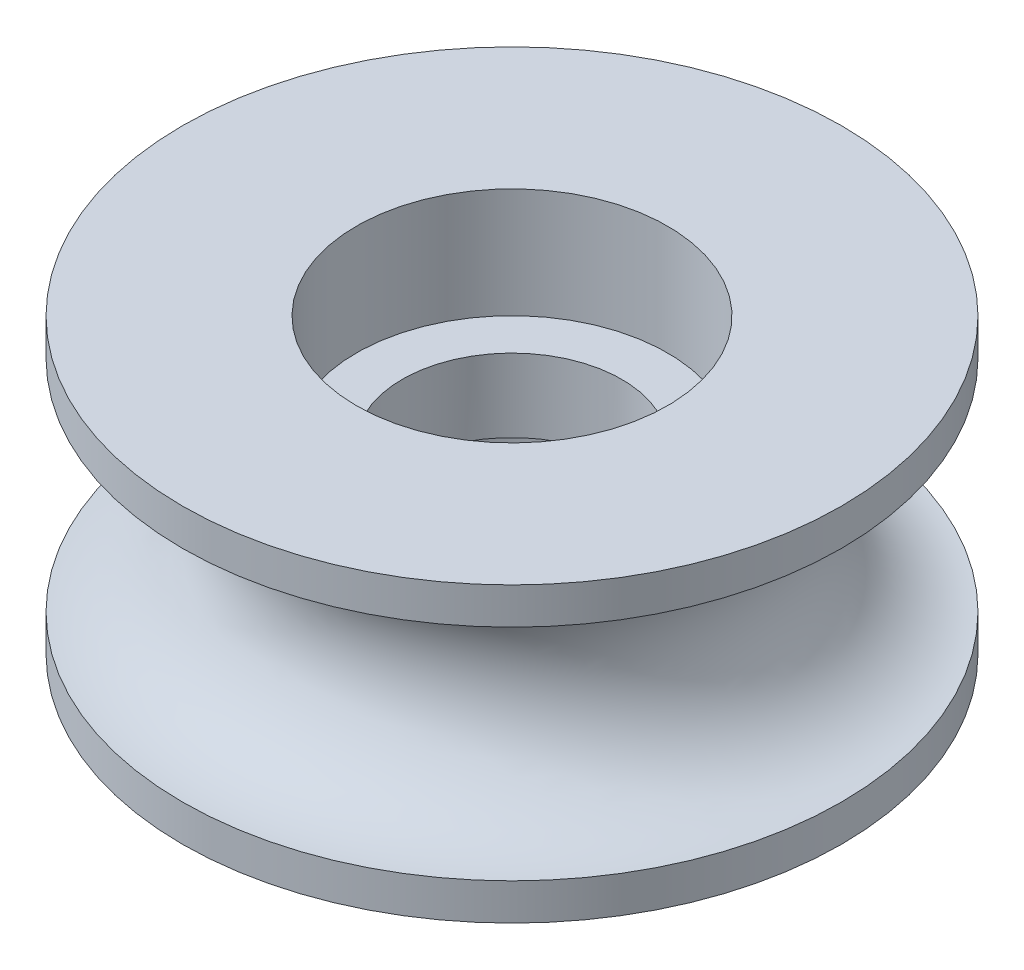
ISO-10303-21;
HEADER;
FILE_DESCRIPTION(('STEP AP214'),'2;1');
FILE_NAME('part.step','',(''),(''),'','','');
FILE_SCHEMA(('AUTOMOTIVE_DESIGN { 1 0 10303 214 1 1 1 1 }'));
ENDSEC;
DATA;
#1=APPLICATION_CONTEXT('core data for automotive mechanical design processes');
#2=APPLICATION_PROTOCOL_DEFINITION('international standard','automotive_design',2000,#1);
#3=PRODUCT_CONTEXT('',#1,'mechanical');
#4=PRODUCT('Part','Part','',(#3));
#5=PRODUCT_RELATED_PRODUCT_CATEGORY('part','',(#4));
#6=PRODUCT_DEFINITION_FORMATION('','',#4);
#7=PRODUCT_DEFINITION_CONTEXT('part definition',#1,'design');
#8=PRODUCT_DEFINITION('design','',#6,#7);
#9=PRODUCT_DEFINITION_SHAPE('','',#8);
#10=(LENGTH_UNIT() NAMED_UNIT(*) SI_UNIT(.MILLI.,.METRE.));
#11=(NAMED_UNIT(*) PLANE_ANGLE_UNIT() SI_UNIT($,.RADIAN.));
#12=(NAMED_UNIT(*) SI_UNIT($,.STERADIAN.) SOLID_ANGLE_UNIT());
#13=UNCERTAINTY_MEASURE_WITH_UNIT(LENGTH_MEASURE(1.E-05),#10,'distance_accuracy_value','');
#14=(GEOMETRIC_REPRESENTATION_CONTEXT(3) GLOBAL_UNCERTAINTY_ASSIGNED_CONTEXT((#13)) GLOBAL_UNIT_ASSIGNED_CONTEXT((#10,
#11,#12)) REPRESENTATION_CONTEXT('',''));
#15=CARTESIAN_POINT('',(0.,0.,0.));
#16=DIRECTION('',(0.,0.,1.));
#17=DIRECTION('',(1.,0.,0.));
#18=AXIS2_PLACEMENT_3D('',#15,#16,#17);
#19=CARTESIAN_POINT('',(0.,4.,0.));
#20=DIRECTION('',(0.,1.,0.));
#21=DIRECTION('',(0.,0.,1.));
#22=AXIS2_PLACEMENT_3D('',#19,#20,#21);
#23=TOROIDAL_SURFACE('',#22,9.,3.);
#24=CARTESIAN_POINT('',(0.,7.,0.));
#25=DIRECTION('',(0.,-1.,0.));
#26=DIRECTION('',(0.,0.,-1.));
#27=AXIS2_PLACEMENT_3D('',#24,#25,#26);
#28=CIRCLE('',#27,9.);
#29=CARTESIAN_POINT('',(0.,7.,-9.));
#30=VERTEX_POINT('',#29);
#31=EDGE_CURVE('E58',#30,#30,#28,.T.);
#32=ORIENTED_EDGE('',*,*,#31,.T.);
#33=EDGE_LOOP('',(#32));
#34=FACE_BOUND('',#33,.T.);
#35=CARTESIAN_POINT('',(0.,0.999999999999998,0.));
#36=DIRECTION('',(0.,1.,0.));
#37=DIRECTION('',(0.,0.,1.));
#38=AXIS2_PLACEMENT_3D('',#35,#36,#37);
#39=CIRCLE('',#38,9.);
#40=CARTESIAN_POINT('',(0.,0.999999999999997,9.));
#41=VERTEX_POINT('',#40);
#42=EDGE_CURVE('E64',#41,#41,#39,.T.);
#43=ORIENTED_EDGE('',*,*,#42,.T.);
#44=EDGE_LOOP('',(#43));
#45=FACE_BOUND('',#44,.T.);
#46=CARTESIAN_POINT('',(-0.839042216983241,2.7566142359992,-6.2134049162351));
#47=CARTESIAN_POINT('',(-0.778867445748128,2.71600835136603,-6.24019144374315));
#48=CARTESIAN_POINT('',(-0.715272521549356,2.67945023643533,-6.26571883641656));
#49=CARTESIAN_POINT('',(-0.581850639612137,2.61546722961522,-6.3119653978564));
#50=CARTESIAN_POINT('',(-0.512013539040098,2.5880575579636,-6.33267653664947));
#51=CARTESIAN_POINT('',(-0.366710249510084,2.5435204567773,-6.36702988057303));
#52=CARTESIAN_POINT('',(-0.291202168813316,2.52648021338659,-6.38061201763591));
#53=CARTESIAN_POINT('',(-0.137446277301218,2.5043009356807,-6.39839811977674));
#54=CARTESIAN_POINT('',(-0.0592037242286854,2.49914021389059,-6.40261917410458));
#55=CARTESIAN_POINT('',(0.0873574473999335,2.5009770383363,-6.4011329397644));
#56=CARTESIAN_POINT('',(0.15571220997481,2.5065562975115,-6.396583709015));
#57=CARTESIAN_POINT('',(0.290213304169746,2.52677040744972,-6.3803854676138));
#58=CARTESIAN_POINT('',(0.35635825660706,2.54141080612395,-6.36873210734518));
#59=CARTESIAN_POINT('',(0.484407612706894,2.57881266106255,-6.33975343529244));
#60=CARTESIAN_POINT('',(0.546338922656077,2.60151538456277,-6.32246921676347));
#61=CARTESIAN_POINT('',(0.665614995069776,2.65418730950447,-6.28378750894963));
#62=CARTESIAN_POINT('',(0.72295872497781,2.68415814074108,-6.2623890973244));
#63=CARTESIAN_POINT('',(0.843230237587762,2.7570907593742,-6.21263847660017));
#64=CARTESIAN_POINT('',(0.905088071315008,2.80144440374656,-6.18374218360401));
#65=CARTESIAN_POINT('',(1.02117444063432,2.89866152083008,-6.12473631233379));
#66=CARTESIAN_POINT('',(1.07539095557328,2.95153812712575,-6.09462491619294));
#67=CARTESIAN_POINT('',(1.18456041991482,3.0754424183087,-6.03022944707885));
#68=CARTESIAN_POINT('',(1.23789939232648,3.14802455546239,-5.99616632629478));
#69=CARTESIAN_POINT('',(1.33146740398419,3.30331331864723,-5.9335890951142));
#70=CARTESIAN_POINT('',(1.37171934334296,3.38600190729159,-5.90506532739615));
#71=CARTESIAN_POINT('',(1.42836087680804,3.53689779547174,-5.86384885278519));
#72=CARTESIAN_POINT('',(1.44824192527958,3.60319586842123,-5.8489655854473));
#73=CARTESIAN_POINT('',(1.47875066463392,3.73899381889097,-5.82588206309383));
#74=CARTESIAN_POINT('',(1.48938882404946,3.80848998002034,-5.81767424811004));
#75=CARTESIAN_POINT('',(1.50079618314392,3.94903595674643,-5.808866638289));
#76=CARTESIAN_POINT('',(1.50152990848995,4.02009044449096,-5.80829419084287));
#77=CARTESIAN_POINT('',(1.49298503692333,4.16123865781718,-5.81490086283688));
#78=CARTESIAN_POINT('',(1.4837030225688,4.23133204719872,-5.82208262807026));
#79=CARTESIAN_POINT('',(1.45639921181877,4.36516559179448,-5.84282412822178));
#80=CARTESIAN_POINT('',(1.43881971929192,4.42904915063551,-5.85606014014815));
#81=CARTESIAN_POINT('',(1.39594578860551,4.55283909027654,-5.88753138014321));
#82=CARTESIAN_POINT('',(1.37064933999496,4.61274442969736,-5.90576791084083));
#83=CARTESIAN_POINT('',(1.30941786113015,4.73533220969837,-5.94844452811385));
#84=CARTESIAN_POINT('',(1.27252631407175,4.79736007818853,-5.9733832430179));
#85=CARTESIAN_POINT('',(1.19088377873181,4.91483463353285,-6.02584859914111));
#86=CARTESIAN_POINT('',(1.14612416004607,4.97027398041858,-6.05337806656145));
#87=CARTESIAN_POINT('',(1.03963295063424,5.08464037760304,-6.11472205704535));
#88=CARTESIAN_POINT('',(0.976299580335855,5.14200662852129,-6.14868203816568));
#89=CARTESIAN_POINT('',(0.840006796243279,5.24567659019197,-6.21415756623795));
#90=CARTESIAN_POINT('',(0.767051064051845,5.29198451301062,-6.24567404081129));
#91=CARTESIAN_POINT('',(0.626624032484747,5.36469192103388,-6.29735574765852));
#92=CARTESIAN_POINT('',(0.560620727684522,5.39318770984243,-6.31854250083015));
#93=CARTESIAN_POINT('',(0.423703405723931,5.44073290161824,-6.35472652542713));
#94=CARTESIAN_POINT('',(0.352795664241826,5.45979413112745,-6.36973154189218));
#95=CARTESIAN_POINT('',(0.207124015948497,5.48749108365551,-6.39175805709268));
#96=CARTESIAN_POINT('',(0.132334569372909,5.49604520066782,-6.39871704023211));
#97=CARTESIAN_POINT('',(-0.0179590566370165,5.50177371454733,-6.40336098497587));
#98=CARTESIAN_POINT('',(-0.0934629065066517,5.49895312562019,-6.40105003296175));
#99=CARTESIAN_POINT('',(-0.233517896272023,5.48318682660209,-6.3883501445157));
#100=CARTESIAN_POINT('',(-0.298307756316123,5.47147888751189,-6.37894957100473));
#101=CARTESIAN_POINT('',(-0.424762785718026,5.44007894262858,-6.35431619134525));
#102=CARTESIAN_POINT('',(-0.486425790205714,5.42038148798274,-6.33907940529305));
#103=CARTESIAN_POINT('',(-0.624567273337318,5.3663923993026,-6.29863135298671));
#104=CARTESIAN_POINT('',(-0.699530667800213,5.32945248471617,-6.27178911613889));
#105=CARTESIAN_POINT('',(-0.84118749124277,5.24468574423585,-6.21374626541252));
#106=CARTESIAN_POINT('',(-0.907867013119732,5.19684098274864,-6.18253850443171));
#107=CARTESIAN_POINT('',(-1.03310359740046,5.09065421393269,-6.11843623248134));
#108=CARTESIAN_POINT('',(-1.09153880302711,5.03217916596821,-6.08552463364408));
#109=CARTESIAN_POINT('',(-1.1984004969118,4.90590700702718,-6.02145196772252));
#110=CARTESIAN_POINT('',(-1.24683506903542,4.8381174996717,-5.99028950170834));
#111=CARTESIAN_POINT('',(-1.32721061133285,4.70279032382235,-5.93633752668418));
#112=CARTESIAN_POINT('',(-1.36044856694665,4.636251006281,-5.91298944169951));
#113=CARTESIAN_POINT('',(-1.41710823493711,4.49740601018439,-5.87219502662799));
#114=CARTESIAN_POINT('',(-1.44053793652232,4.42510508205912,-5.8547438954833));
#115=CARTESIAN_POINT('',(-1.47645540236191,4.27571592934383,-5.8276578302596));
#116=CARTESIAN_POINT('',(-1.48885329366726,4.19859376526119,-5.81808714205552));
#117=CARTESIAN_POINT('',(-1.50142060757287,4.04278148925735,-5.80838509764423));
#118=CARTESIAN_POINT('',(-1.50159873480468,3.96409253339514,-5.80824702220623));
#119=CARTESIAN_POINT('',(-1.4905310950267,3.81851355083997,-5.81679201697756));
#120=CARTESIAN_POINT('',(-1.48078277813893,3.75143133734203,-5.82431881590392));
#121=CARTESIAN_POINT('',(-1.45266209218681,3.6201570193197,-5.84564135631663));
#122=CARTESIAN_POINT('',(-1.43428815138696,3.55596544385596,-5.85943824030456));
#123=CARTESIAN_POINT('',(-1.38885165385155,3.42919994802583,-5.89267074567006));
#124=CARTESIAN_POINT('',(-1.36146632182186,3.3667978042782,-5.91231274864048));
#125=CARTESIAN_POINT('',(-1.29918554779437,3.24722541288822,-5.95536568786954));
#126=CARTESIAN_POINT('',(-1.26428131654431,3.1900614008151,-5.97878102684748));
#127=CARTESIAN_POINT('',(-1.1802431564614,3.07083789567037,-6.03254993555786));
#128=CARTESIAN_POINT('',(-1.1296612523333,3.0100097393912,-6.06336453383014));
#129=CARTESIAN_POINT('',(-1.01981900416562,2.89720869675225,-6.12536638270032));
#130=CARTESIAN_POINT('',(-0.960576408408863,2.84521815986278,-6.15655275416433));
#131=CARTESIAN_POINT('',(-0.878272671222334,2.783775059369,-6.1956404859258));
#132=CARTESIAN_POINT('',(-0.858842598380422,2.7699755165858,-6.20459086592665));
#133=CARTESIAN_POINT('',(-0.839042216983241,2.7566142359992,-6.2134049162351));
#134=B_SPLINE_CURVE_WITH_KNOTS('',3,(#46,#47,#48,#49,#50,#51,#52,#53,#54,#55,#56,#57,#58,#59,
#60,#61,#62,#63,#64,#65,#66,#67,#68,#69,#70,#71,#72,#73,#74,#75,#76,#77,#78,#79,#80,#81,#82,#83,
#84,#85,#86,#87,#88,#89,#90,#91,#92,#93,#94,#95,#96,#97,#98,#99,#100,#101,#102,#103,#104,#105,
#106,#107,#108,#109,#110,#111,#112,#113,#114,#115,#116,#117,#118,#119,#120,#121,#122,#123,#124,
#125,#126,#127,#128,#129,#130,#131,#132,#133),.UNSPECIFIED.,.T.,.F.,(4,2,2,2,2,2,2,2,2,2,2,2,2,
2,2,2,2,2,2,2,2,2,2,2,2,2,2,2,2,2,2,2,2,2,2,2,2,2,2,2,2,2,2,4),(0.,0.232075184162651,
0.464534568616155,0.698922397816386,0.932881983721874,1.13804527395809,1.34333430503283,
1.54715752187379,1.75102648621461,1.99438561708667,2.23812340540085,2.52560298015834,
2.8125767721069,3.02409309032498,3.23536953085959,3.4474024921855,3.65950782355515,
3.86140108172995,4.06334698289434,4.2915962068457,4.52009737524529,4.79479404653178,
5.06938591963323,5.29336120682539,5.517055017773,5.74247543355111,5.96779649021174,
6.16645172457472,6.36524267030044,6.627174079626,6.88953944616072,7.15544809968685,
7.42114096102111,7.65409316140889,7.88685524211915,8.12149665162215,8.35597091483457,
8.55964709051773,8.76336039388072,8.97535307360315,9.18759492108332,9.44137355550077,
9.69463923024775,9.77100307949759),.UNSPECIFIED.);
#135=CARTESIAN_POINT('',(-0.839042216983241,2.7566142359992,-6.2134049162351));
#136=VERTEX_POINT('',#135);
#137=EDGE_CURVE('E10',#136,#136,#134,.T.);
#138=ORIENTED_EDGE('',*,*,#137,.T.);
#139=EDGE_LOOP('',(#138));
#140=FACE_BOUND('',#139,.T.);
#141=ADVANCED_FACE('F36',(#34,#45,#140),#23,.F.);
#142=CARTESIAN_POINT('',(0.,0.,0.));
#143=DIRECTION('',(0.,1.,0.));
#144=DIRECTION('',(0.,0.,1.));
#145=AXIS2_PLACEMENT_3D('',#142,#143,#144);
#146=CYLINDRICAL_SURFACE('',#145,3.);
#147=CARTESIAN_POINT('',(0.,5.,0.));
#148=DIRECTION('',(0.,1.,0.));
#149=DIRECTION('',(0.,0.,1.));
#150=AXIS2_PLACEMENT_3D('',#147,#148,#149);
#151=CIRCLE('',#150,3.);
#152=CARTESIAN_POINT('',(0.,5.,3.));
#153=VERTEX_POINT('',#152);
#154=EDGE_CURVE('E67',#153,#153,#151,.F.);
#155=ORIENTED_EDGE('',*,*,#154,.F.);
#156=EDGE_LOOP('',(#155));
#157=FACE_BOUND('',#156,.T.);
#158=CARTESIAN_POINT('',(0.,3.,0.));
#159=DIRECTION('',(0.,-1.,0.));
#160=DIRECTION('',(0.,0.,-1.));
#161=AXIS2_PLACEMENT_3D('',#158,#159,#160);
#162=CIRCLE('',#161,3.);
#163=CARTESIAN_POINT('',(0.,3.,-3.));
#164=VERTEX_POINT('',#163);
#165=EDGE_CURVE('E72',#164,#164,#162,.F.);
#166=ORIENTED_EDGE('',*,*,#165,.F.);
#167=EDGE_LOOP('',(#166));
#168=FACE_BOUND('',#167,.T.);
#169=ADVANCED_FACE('F109',(#157,#168),#146,.F.);
#170=CARTESIAN_POINT('',(0.,8.,0.));
#171=DIRECTION('',(0.,-1.,0.));
#172=DIRECTION('',(0.,0.,-1.));
#173=AXIS2_PLACEMENT_3D('',#170,#171,#172);
#174=CYLINDRICAL_SURFACE('',#173,9.);
#175=CARTESIAN_POINT('',(0.,8.,0.));
#176=DIRECTION('',(0.,1.,0.));
#177=DIRECTION('',(0.,0.,1.));
#178=AXIS2_PLACEMENT_3D('',#175,#176,#177);
#179=CIRCLE('',#178,9.);
#180=CARTESIAN_POINT('',(0.,8.,9.));
#181=VERTEX_POINT('',#180);
#182=EDGE_CURVE('E47',#181,#181,#179,.T.);
#183=ORIENTED_EDGE('',*,*,#182,.F.);
#184=EDGE_LOOP('',(#183));
#185=FACE_BOUND('',#184,.T.);
#186=ORIENTED_EDGE('',*,*,#31,.F.);
#187=EDGE_LOOP('',(#186));
#188=FACE_BOUND('',#187,.T.);
#189=ADVANCED_FACE('F101',(#185,#188),#174,.T.);
#190=CARTESIAN_POINT('',(0.,8.,0.));
#191=DIRECTION('',(0.,1.,0.));
#192=DIRECTION('',(0.,0.,1.));
#193=AXIS2_PLACEMENT_3D('',#190,#191,#192);
#194=PLANE('',#193);
#195=CARTESIAN_POINT('',(0.,8.,0.));
#196=DIRECTION('',(0.,1.,0.));
#197=DIRECTION('',(0.,0.,1.));
#198=AXIS2_PLACEMENT_3D('',#195,#196,#197);
#199=CIRCLE('',#198,4.25);
#200=CARTESIAN_POINT('',(0.,8.,4.25));
#201=VERTEX_POINT('',#200);
#202=EDGE_CURVE('E61',#201,#201,#199,.T.);
#203=ORIENTED_EDGE('',*,*,#202,.F.);
#204=EDGE_LOOP('',(#203));
#205=FACE_BOUND('',#204,.T.);
#206=ORIENTED_EDGE('',*,*,#182,.T.);
#207=EDGE_LOOP('',(#206));
#208=FACE_BOUND('',#207,.T.);
#209=ADVANCED_FACE('F98',(#205,#208),#194,.T.);
#210=ORIENTED_EDGE('',*,*,#137,.F.);
#211=EDGE_LOOP('',(#210));
#212=FACE_BOUND('',#211,.T.);
#213=ADVANCED_FACE('F100',(#212),#23,.F.);
#214=CARTESIAN_POINT('',(0.,0.,0.));
#215=DIRECTION('',(0.,1.,0.));
#216=DIRECTION('',(0.,0.,1.));
#217=AXIS2_PLACEMENT_3D('',#214,#215,#216);
#218=PLANE('',#217);
#219=CARTESIAN_POINT('',(0.,0.,0.));
#220=DIRECTION('',(0.,1.,0.));
#221=DIRECTION('',(0.,0.,1.));
#222=AXIS2_PLACEMENT_3D('',#219,#220,#221);
#223=CIRCLE('',#222,4.25);
#224=CARTESIAN_POINT('',(0.,0.,4.25));
#225=VERTEX_POINT('',#224);
#226=EDGE_CURVE('E79',#225,#225,#223,.T.);
#227=ORIENTED_EDGE('',*,*,#226,.T.);
#228=EDGE_LOOP('',(#227));
#229=FACE_BOUND('',#228,.T.);
#230=CARTESIAN_POINT('',(0.,0.,0.));
#231=DIRECTION('',(0.,1.,0.));
#232=DIRECTION('',(0.,0.,1.));
#233=AXIS2_PLACEMENT_3D('',#230,#231,#232);
#234=CIRCLE('',#233,9.);
#235=CARTESIAN_POINT('',(0.,0.,9.));
#236=VERTEX_POINT('',#235);
#237=EDGE_CURVE('E53',#236,#236,#234,.T.);
#238=ORIENTED_EDGE('',*,*,#237,.F.);
#239=EDGE_LOOP('',(#238));
#240=FACE_BOUND('',#239,.T.);
#241=ADVANCED_FACE('F107',(#229,#240),#218,.F.);
#242=ORIENTED_EDGE('',*,*,#237,.T.);
#243=EDGE_LOOP('',(#242));
#244=FACE_BOUND('',#243,.T.);
#245=ORIENTED_EDGE('',*,*,#42,.F.);
#246=EDGE_LOOP('',(#245));
#247=FACE_BOUND('',#246,.T.);
#248=ADVANCED_FACE('F112',(#244,#247),#174,.T.);
#249=CARTESIAN_POINT('',(0.,5.,0.));
#250=DIRECTION('',(0.,1.,0.));
#251=DIRECTION('',(0.,0.,1.));
#252=AXIS2_PLACEMENT_3D('',#249,#250,#251);
#253=PLANE('',#252);
#254=CARTESIAN_POINT('',(0.,5.,0.));
#255=DIRECTION('',(0.,1.,0.));
#256=DIRECTION('',(0.,0.,1.));
#257=AXIS2_PLACEMENT_3D('',#254,#255,#256);
#258=CIRCLE('',#257,4.25);
#259=CARTESIAN_POINT('',(0.,5.,4.25));
#260=VERTEX_POINT('',#259);
#261=EDGE_CURVE('E71',#260,#260,#258,.T.);
#262=ORIENTED_EDGE('',*,*,#261,.T.);
#263=EDGE_LOOP('',(#262));
#264=FACE_BOUND('',#263,.T.);
#265=ORIENTED_EDGE('',*,*,#154,.T.);
#266=EDGE_LOOP('',(#265));
#267=FACE_BOUND('',#266,.T.);
#268=ADVANCED_FACE('F88',(#264,#267),#253,.T.);
#269=CARTESIAN_POINT('',(0.,5.,0.));
#270=DIRECTION('',(0.,1.,0.));
#271=DIRECTION('',(0.,0.,1.));
#272=AXIS2_PLACEMENT_3D('',#269,#270,#271);
#273=CYLINDRICAL_SURFACE('',#272,4.25);
#274=ORIENTED_EDGE('',*,*,#261,.F.);
#275=EDGE_LOOP('',(#274));
#276=FACE_BOUND('',#275,.T.);
#277=ORIENTED_EDGE('',*,*,#202,.T.);
#278=EDGE_LOOP('',(#277));
#279=FACE_BOUND('',#278,.T.);
#280=ADVANCED_FACE('F91',(#276,#279),#273,.F.);
#281=CARTESIAN_POINT('',(0.,3.,0.));
#282=DIRECTION('',(0.,-1.,0.));
#283=DIRECTION('',(0.,0.,1.));
#284=AXIS2_PLACEMENT_3D('',#281,#282,#283);
#285=PLANE('',#284);
#286=CARTESIAN_POINT('',(0.,3.,0.));
#287=DIRECTION('',(0.,1.,0.));
#288=DIRECTION('',(0.,0.,1.));
#289=AXIS2_PLACEMENT_3D('',#286,#287,#288);
#290=CIRCLE('',#289,4.25);
#291=CARTESIAN_POINT('',(0.,3.,4.25));
#292=VERTEX_POINT('',#291);
#293=EDGE_CURVE('E74',#292,#292,#290,.T.);
#294=ORIENTED_EDGE('',*,*,#293,.F.);
#295=EDGE_LOOP('',(#294));
#296=FACE_BOUND('',#295,.T.);
#297=ORIENTED_EDGE('',*,*,#165,.T.);
#298=EDGE_LOOP('',(#297));
#299=FACE_BOUND('',#298,.T.);
#300=ADVANCED_FACE('F94',(#296,#299),#285,.T.);
#301=CARTESIAN_POINT('',(0.,3.,0.));
#302=DIRECTION('',(0.,-1.,0.));
#303=DIRECTION('',(0.,0.,-1.));
#304=AXIS2_PLACEMENT_3D('',#301,#302,#303);
#305=CYLINDRICAL_SURFACE('',#304,4.25);
#306=ORIENTED_EDGE('',*,*,#293,.T.);
#307=EDGE_LOOP('',(#306));
#308=FACE_BOUND('',#307,.T.);
#309=ORIENTED_EDGE('',*,*,#226,.F.);
#310=EDGE_LOOP('',(#309));
#311=FACE_BOUND('',#310,.T.);
#312=ADVANCED_FACE('F135',(#308,#311),#305,.F.);
#313=CLOSED_SHELL('',(#141,#169,#189,#209,#213,#241,#248,#268,#280,#300,#312));
#314=MANIFOLD_SOLID_BREP('B2',#313);
#315=ADVANCED_BREP_SHAPE_REPRESENTATION('',(#18,#314),#14);
#316=SHAPE_DEFINITION_REPRESENTATION(#9,#315);
ENDSEC;
END-ISO-10303-21;
